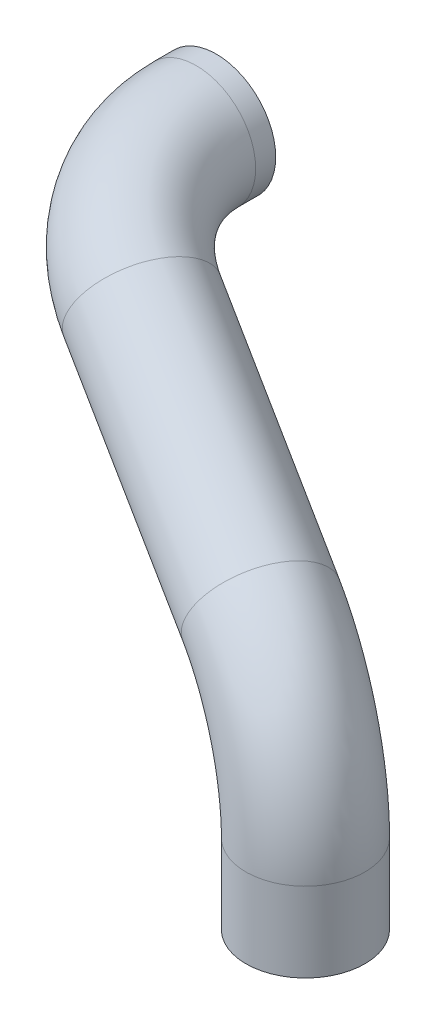
ISO-10303-21;
HEADER;
FILE_DESCRIPTION(('STEP AP214'),'2;1');
FILE_NAME('part.step','',(''),(''),'','','');
FILE_SCHEMA(('AUTOMOTIVE_DESIGN { 1 0 10303 214 1 1 1 1 }'));
ENDSEC;
DATA;
#1=APPLICATION_CONTEXT('core data for automotive mechanical design processes');
#2=APPLICATION_PROTOCOL_DEFINITION('international standard','automotive_design',2000,#1);
#3=PRODUCT_CONTEXT('',#1,'mechanical');
#4=PRODUCT('Part','Part','',(#3));
#5=PRODUCT_RELATED_PRODUCT_CATEGORY('part','',(#4));
#6=PRODUCT_DEFINITION_FORMATION('','',#4);
#7=PRODUCT_DEFINITION_CONTEXT('part definition',#1,'design');
#8=PRODUCT_DEFINITION('design','',#6,#7);
#9=PRODUCT_DEFINITION_SHAPE('','',#8);
#10=(LENGTH_UNIT() NAMED_UNIT(*) SI_UNIT(.MILLI.,.METRE.));
#11=(NAMED_UNIT(*) PLANE_ANGLE_UNIT() SI_UNIT($,.RADIAN.));
#12=(NAMED_UNIT(*) SI_UNIT($,.STERADIAN.) SOLID_ANGLE_UNIT());
#13=UNCERTAINTY_MEASURE_WITH_UNIT(LENGTH_MEASURE(1.E-05),#10,'distance_accuracy_value','');
#14=(GEOMETRIC_REPRESENTATION_CONTEXT(3) GLOBAL_UNCERTAINTY_ASSIGNED_CONTEXT((#13)) GLOBAL_UNIT_ASSIGNED_CONTEXT((#10,
#11,#12)) REPRESENTATION_CONTEXT('',''));
#15=CARTESIAN_POINT('',(0.,0.,0.));
#16=DIRECTION('',(0.,0.,1.));
#17=DIRECTION('',(1.,0.,0.));
#18=AXIS2_PLACEMENT_3D('',#15,#16,#17);
#19=CARTESIAN_POINT('',(0.,0.,0.));
#20=DIRECTION('',(0.,-1.,0.));
#21=DIRECTION('',(0.635217758096736,0.,-0.772333088633756));
#22=AXIS2_PLACEMENT_3D('',#19,#20,#21);
#23=PLANE('',#22);
#24=CARTESIAN_POINT('',(0.,0.,0.));
#25=DIRECTION('',(0.,-1.,0.));
#26=DIRECTION('',(1.,0.,0.));
#27=AXIS2_PLACEMENT_3D('',#24,#25,#26);
#28=CIRCLE('',#27,7.5);
#29=CARTESIAN_POINT('',(7.50000000000001,0.,0.));
#30=VERTEX_POINT('',#29);
#31=EDGE_CURVE('E76',#30,#30,#28,.T.);
#32=ORIENTED_EDGE('',*,*,#31,.F.);
#33=EDGE_LOOP('',(#32));
#34=FACE_BOUND('',#33,.T.);
#35=CARTESIAN_POINT('',(0.,0.,0.));
#36=DIRECTION('',(0.,-1.,0.));
#37=DIRECTION('',(0.635217758096736,0.,-0.772333088633756));
#38=AXIS2_PLACEMENT_3D('',#35,#36,#37);
#39=CIRCLE('',#38,10.);
#40=CARTESIAN_POINT('',(6.35217758096737,0.,-7.72333088633756));
#41=VERTEX_POINT('',#40);
#42=EDGE_CURVE('E69',#41,#41,#39,.T.);
#43=ORIENTED_EDGE('',*,*,#42,.T.);
#44=EDGE_LOOP('',(#43));
#45=FACE_BOUND('',#44,.T.);
#46=ADVANCED_FACE('F47',(#34,#45),#23,.T.);
#47=CARTESIAN_POINT('',(-65.,60.,-50.));
#48=DIRECTION('',(0.,0.,1.));
#49=DIRECTION('',(1.,0.,0.));
#50=AXIS2_PLACEMENT_3D('',#47,#48,#49);
#51=PLANE('',#50);
#52=CARTESIAN_POINT('',(-65.,60.,-50.));
#53=DIRECTION('',(0.,0.,1.));
#54=DIRECTION('',(1.,0.,0.));
#55=AXIS2_PLACEMENT_3D('',#52,#53,#54);
#56=CIRCLE('',#55,7.5);
#57=CARTESIAN_POINT('',(-57.5,60.,-50.));
#58=VERTEX_POINT('',#57);
#59=EDGE_CURVE('E72',#58,#58,#56,.T.);
#60=ORIENTED_EDGE('',*,*,#59,.T.);
#61=EDGE_LOOP('',(#60));
#62=FACE_BOUND('',#61,.T.);
#63=CARTESIAN_POINT('',(-65.,60.,-50.));
#64=DIRECTION('',(0.,0.,1.));
#65=DIRECTION('',(1.,0.,0.));
#66=AXIS2_PLACEMENT_3D('',#63,#64,#65);
#67=CIRCLE('',#66,10.);
#68=CARTESIAN_POINT('',(-55.,60.,-50.));
#69=VERTEX_POINT('',#68);
#70=EDGE_CURVE('E11',#69,#69,#67,.T.);
#71=ORIENTED_EDGE('',*,*,#70,.F.);
#72=EDGE_LOOP('',(#71));
#73=FACE_BOUND('',#72,.T.);
#74=ADVANCED_FACE('F102',(#62,#73),#51,.F.);
#75=CARTESIAN_POINT('',(0.,0.,0.));
#76=DIRECTION('',(0.,1.,0.));
#77=DIRECTION('',(-1.,0.,0.));
#78=AXIS2_PLACEMENT_3D('',#75,#76,#77);
#79=CYLINDRICAL_SURFACE('',#78,10.);
#80=CARTESIAN_POINT('',(0.,13.3700696248249,0.));
#81=DIRECTION('',(0.,-1.,0.));
#82=DIRECTION('',(0.635217758096736,0.,-0.772333088633756));
#83=AXIS2_PLACEMENT_3D('',#80,#81,#82);
#84=CIRCLE('',#83,10.);
#85=CARTESIAN_POINT('',(9.07959384500453,13.3700696248249,4.19058177461747));
#86=VERTEX_POINT('',#85);
#87=EDGE_CURVE('E66',#86,#86,#84,.T.);
#88=ORIENTED_EDGE('',*,*,#87,.T.);
#89=EDGE_LOOP('',(#88));
#90=FACE_BOUND('',#89,.T.);
#91=ORIENTED_EDGE('',*,*,#42,.F.);
#92=EDGE_LOOP('',(#91));
#93=FACE_BOUND('',#92,.T.);
#94=ADVANCED_FACE('F106',(#90,#93),#79,.T.);
#95=CARTESIAN_POINT('',(-22.6989846125113,13.3700696248249,-10.4764544365437));
#96=DIRECTION('',(-0.419058177461747,0.,0.907959384500452));
#97=DIRECTION('',(0.907959384500452,0.,0.419058177461747));
#98=AXIS2_PLACEMENT_3D('',#95,#96,#97);
#99=TOROIDAL_SURFACE('',#98,25.,10.);
#100=CARTESIAN_POINT('',(-13.9259638020795,36.4273679086521,-6.42736790865209));
#101=DIRECTION('',(0.83740361432108,-0.386493975840499,0.386493975840498));
#102=DIRECTION('',(0.494231619107533,0.233431560411908,-0.83740361432108));
#103=AXIS2_PLACEMENT_3D('',#100,#101,#102);
#104=CIRCLE('',#103,10.);
#105=CARTESIAN_POINT('',(-10.4167554779068,45.6502872221829,-4.80773329749545));
#106=VERTEX_POINT('',#105);
#107=EDGE_CURVE('E61',#106,#106,#104,.T.);
#108=CARTESIAN_POINT('',(-22.6989846125113,13.3700696248249,-10.4764544365437));
#109=DIRECTION('',(-0.419058177461747,0.,0.907959384500452));
#110=DIRECTION('',(0.907959384500452,0.,0.419058177461747));
#111=AXIS2_PLACEMENT_3D('',#108,#109,#110);
#112=CIRCLE('',#111,35.);
#113=EDGE_CURVE('',#86,#106,#112,.T.);
#114=ORIENTED_EDGE('',*,*,#87,.F.);
#115=ORIENTED_EDGE('',*,*,#107,.T.);
#116=ORIENTED_EDGE('',*,*,#113,.T.);
#117=ORIENTED_EDGE('',*,*,#113,.F.);
#118=EDGE_LOOP('',(#114,#116,#115,#117));
#119=FACE_BOUND('',#118,.T.);
#120=ADVANCED_FACE('F108',(#119),#99,.T.);
#121=CARTESIAN_POINT('',(-13.9259638020795,36.4273679086521,-6.42736790865207));
#122=DIRECTION('',(-0.83740361432108,0.386493975840498,-0.386493975840498));
#123=DIRECTION('',(-0.419058177461747,0.,0.907959384500452));
#124=AXIS2_PLACEMENT_3D('',#121,#122,#123);
#125=CYLINDRICAL_SURFACE('',#124,10.);
#126=CARTESIAN_POINT('',(-51.0740361979205,53.5726320913479,-23.5726320913479));
#127=DIRECTION('',(0.83740361432108,-0.386493975840498,0.386493975840498));
#128=DIRECTION('',(0.494231619107533,0.233431560411908,-0.83740361432108));
#129=AXIS2_PLACEMENT_3D('',#126,#127,#128);
#130=CIRCLE('',#129,10.);
#131=CARTESIAN_POINT('',(-54.5832445220932,55.1922667025046,-14.3497127778171));
#132=VERTEX_POINT('',#131);
#133=EDGE_CURVE('E57',#132,#132,#130,.T.);
#134=ORIENTED_EDGE('',*,*,#133,.T.);
#135=EDGE_LOOP('',(#134));
#136=FACE_BOUND('',#135,.T.);
#137=ORIENTED_EDGE('',*,*,#107,.F.);
#138=EDGE_LOOP('',(#137));
#139=FACE_BOUND('',#138,.T.);
#140=ADVANCED_FACE('F115',(#136,#139),#125,.T.);
#141=CARTESIAN_POINT('',(-42.3010153874887,49.5235455634563,-46.629930375175));
#142=DIRECTION('',(-0.419058177461747,-0.907959384500452,0.));
#143=DIRECTION('',(0.907959384500452,-0.419058177461747,0.));
#144=AXIS2_PLACEMENT_3D('',#141,#142,#143);
#145=TOROIDAL_SURFACE('',#144,25.,10.);
#146=CARTESIAN_POINT('',(-65.,60.,-46.6299303751751));
#147=DIRECTION('',(0.,0.,1.));
#148=DIRECTION('',(1.,0.,0.));
#149=AXIS2_PLACEMENT_3D('',#146,#147,#148);
#150=CIRCLE('',#149,10.);
#151=CARTESIAN_POINT('',(-74.0795938450045,64.1905817746175,-46.6299303751751));
#152=VERTEX_POINT('',#151);
#153=EDGE_CURVE('E53',#152,#152,#150,.T.);
#154=CARTESIAN_POINT('',(-42.3010153874887,49.5235455634563,-46.629930375175));
#155=DIRECTION('',(-0.419058177461747,-0.907959384500452,0.));
#156=DIRECTION('',(0.907959384500452,-0.419058177461747,0.));
#157=AXIS2_PLACEMENT_3D('',#154,#155,#156);
#158=CIRCLE('',#157,35.);
#159=EDGE_CURVE('',#132,#152,#158,.T.);
#160=ORIENTED_EDGE('',*,*,#133,.F.);
#161=ORIENTED_EDGE('',*,*,#153,.T.);
#162=ORIENTED_EDGE('',*,*,#159,.T.);
#163=ORIENTED_EDGE('',*,*,#159,.F.);
#164=EDGE_LOOP('',(#160,#162,#161,#163));
#165=FACE_BOUND('',#164,.T.);
#166=ADVANCED_FACE('F121',(#165),#145,.T.);
#167=CARTESIAN_POINT('',(-65.,60.,-46.629930375175));
#168=DIRECTION('',(0.,0.,-1.));
#169=DIRECTION('',(-1.,0.,0.));
#170=AXIS2_PLACEMENT_3D('',#167,#168,#169);
#171=CYLINDRICAL_SURFACE('',#170,10.);
#172=ORIENTED_EDGE('',*,*,#70,.T.);
#173=EDGE_LOOP('',(#172));
#174=FACE_BOUND('',#173,.T.);
#175=ORIENTED_EDGE('',*,*,#153,.F.);
#176=EDGE_LOOP('',(#175));
#177=FACE_BOUND('',#176,.T.);
#178=ADVANCED_FACE('F96',(#174,#177),#171,.T.);
#179=CARTESIAN_POINT('',(0.,0.,0.));
#180=DIRECTION('',(0.,1.,0.));
#181=DIRECTION('',(-1.,0.,0.));
#182=AXIS2_PLACEMENT_3D('',#179,#180,#181);
#183=CYLINDRICAL_SURFACE('',#182,7.5);
#184=CARTESIAN_POINT('',(0.,13.3700696248249,0.));
#185=DIRECTION('',(0.,1.,0.));
#186=DIRECTION('',(-1.,0.,0.));
#187=AXIS2_PLACEMENT_3D('',#184,#185,#186);
#188=CIRCLE('',#187,7.5);
#189=CARTESIAN_POINT('',(6.80969538375339,13.3700696248249,3.1429363309631));
#190=VERTEX_POINT('',#189);
#191=EDGE_CURVE('E79',#190,#190,#188,.F.);
#192=ORIENTED_EDGE('',*,*,#191,.F.);
#193=EDGE_LOOP('',(#192));
#194=FACE_BOUND('',#193,.T.);
#195=ORIENTED_EDGE('',*,*,#31,.T.);
#196=EDGE_LOOP('',(#195));
#197=FACE_BOUND('',#196,.T.);
#198=ADVANCED_FACE('F93',(#194,#197),#183,.F.);
#199=CARTESIAN_POINT('',(-22.6989846125113,13.3700696248249,-10.4764544365437));
#200=DIRECTION('',(-0.419058177461747,0.,0.907959384500452));
#201=DIRECTION('',(0.907959384500452,0.,0.419058177461747));
#202=AXIS2_PLACEMENT_3D('',#199,#200,#201);
#203=TOROIDAL_SURFACE('',#202,25.,7.5);
#204=CARTESIAN_POINT('',(-13.9259638020795,36.4273679086521,-6.42736790865207));
#205=DIRECTION('',(0.83740361432108,-0.386493975840499,0.386493975840498));
#206=DIRECTION('',(0.419058177461748,0.907959384500451,0.));
#207=AXIS2_PLACEMENT_3D('',#204,#205,#206);
#208=CIRCLE('',#207,7.5);
#209=CARTESIAN_POINT('',(-11.2940575589499,43.3445573938002,-5.21264195028459));
#210=VERTEX_POINT('',#209);
#211=EDGE_CURVE('E85',#210,#210,#208,.T.);
#212=CARTESIAN_POINT('',(-22.6989846125113,13.3700696248249,-10.4764544365437));
#213=DIRECTION('',(-0.419058177461747,0.,0.907959384500452));
#214=DIRECTION('',(0.907959384500452,0.,0.419058177461747));
#215=AXIS2_PLACEMENT_3D('',#212,#213,#214);
#216=CIRCLE('',#215,32.5);
#217=EDGE_CURVE('',#190,#210,#216,.T.);
#218=ORIENTED_EDGE('',*,*,#191,.T.);
#219=ORIENTED_EDGE('',*,*,#211,.F.);
#220=ORIENTED_EDGE('',*,*,#217,.T.);
#221=ORIENTED_EDGE('',*,*,#217,.F.);
#222=EDGE_LOOP('',(#218,#220,#219,#221));
#223=FACE_BOUND('',#222,.T.);
#224=ADVANCED_FACE('F91',(#223),#203,.F.);
#225=CARTESIAN_POINT('',(-13.9259638020795,36.4273679086521,-6.42736790865207));
#226=DIRECTION('',(-0.83740361432108,0.386493975840498,-0.386493975840498));
#227=DIRECTION('',(-0.419058177461747,0.,0.907959384500452));
#228=AXIS2_PLACEMENT_3D('',#225,#226,#227);
#229=CYLINDRICAL_SURFACE('',#228,7.5);
#230=CARTESIAN_POINT('',(-51.0740361979205,53.5726320913479,-23.5726320913479));
#231=DIRECTION('',(-0.83740361432108,0.386493975840498,-0.386493975840498));
#232=DIRECTION('',(-0.419058177461747,0.,0.907959384500452));
#233=AXIS2_PLACEMENT_3D('',#230,#231,#232);
#234=CIRCLE('',#233,7.5);
#235=CARTESIAN_POINT('',(-53.70594244105,54.7873580497154,-16.6554426061998));
#236=VERTEX_POINT('',#235);
#237=EDGE_CURVE('E82',#236,#236,#234,.F.);
#238=ORIENTED_EDGE('',*,*,#237,.F.);
#239=EDGE_LOOP('',(#238));
#240=FACE_BOUND('',#239,.T.);
#241=ORIENTED_EDGE('',*,*,#211,.T.);
#242=EDGE_LOOP('',(#241));
#243=FACE_BOUND('',#242,.T.);
#244=ADVANCED_FACE('F164',(#240,#243),#229,.F.);
#245=CARTESIAN_POINT('',(-42.3010153874887,49.5235455634563,-46.629930375175));
#246=DIRECTION('',(-0.419058177461747,-0.907959384500452,0.));
#247=DIRECTION('',(0.907959384500452,-0.419058177461747,0.));
#248=AXIS2_PLACEMENT_3D('',#245,#246,#247);
#249=TOROIDAL_SURFACE('',#248,25.,7.5);
#250=CARTESIAN_POINT('',(-65.,60.,-46.629930375175));
#251=DIRECTION('',(0.,0.,1.));
#252=DIRECTION('',(0.,-1.,0.));
#253=AXIS2_PLACEMENT_3D('',#250,#251,#252);
#254=CIRCLE('',#253,7.5);
#255=CARTESIAN_POINT('',(-71.8096953837534,63.1429363309631,-46.629930375175));
#256=VERTEX_POINT('',#255);
#257=EDGE_CURVE('E75',#256,#256,#254,.T.);
#258=CARTESIAN_POINT('',(-42.3010153874887,49.5235455634563,-46.629930375175));
#259=DIRECTION('',(-0.419058177461747,-0.907959384500452,0.));
#260=DIRECTION('',(0.907959384500452,-0.419058177461747,0.));
#261=AXIS2_PLACEMENT_3D('',#258,#259,#260);
#262=CIRCLE('',#261,32.5);
#263=EDGE_CURVE('',#236,#256,#262,.T.);
#264=ORIENTED_EDGE('',*,*,#237,.T.);
#265=ORIENTED_EDGE('',*,*,#257,.F.);
#266=ORIENTED_EDGE('',*,*,#263,.T.);
#267=ORIENTED_EDGE('',*,*,#263,.F.);
#268=EDGE_LOOP('',(#264,#266,#265,#267));
#269=FACE_BOUND('',#268,.T.);
#270=ADVANCED_FACE('F174',(#269),#249,.F.);
#271=CARTESIAN_POINT('',(-65.,60.,-46.629930375175));
#272=DIRECTION('',(0.,0.,-1.));
#273=DIRECTION('',(-1.,0.,0.));
#274=AXIS2_PLACEMENT_3D('',#271,#272,#273);
#275=CYLINDRICAL_SURFACE('',#274,7.5);
#276=ORIENTED_EDGE('',*,*,#59,.F.);
#277=EDGE_LOOP('',(#276));
#278=FACE_BOUND('',#277,.T.);
#279=ORIENTED_EDGE('',*,*,#257,.T.);
#280=EDGE_LOOP('',(#279));
#281=FACE_BOUND('',#280,.T.);
#282=ADVANCED_FACE('F103',(#278,#281),#275,.F.);
#283=CLOSED_SHELL('',(#46,#74,#94,#120,#140,#166,#178,#198,#224,#244,#270,#282));
#284=MANIFOLD_SOLID_BREP('B2',#283);
#285=ADVANCED_BREP_SHAPE_REPRESENTATION('',(#18,#284),#14);
#286=SHAPE_DEFINITION_REPRESENTATION(#9,#285);
ENDSEC;
END-ISO-10303-21;
